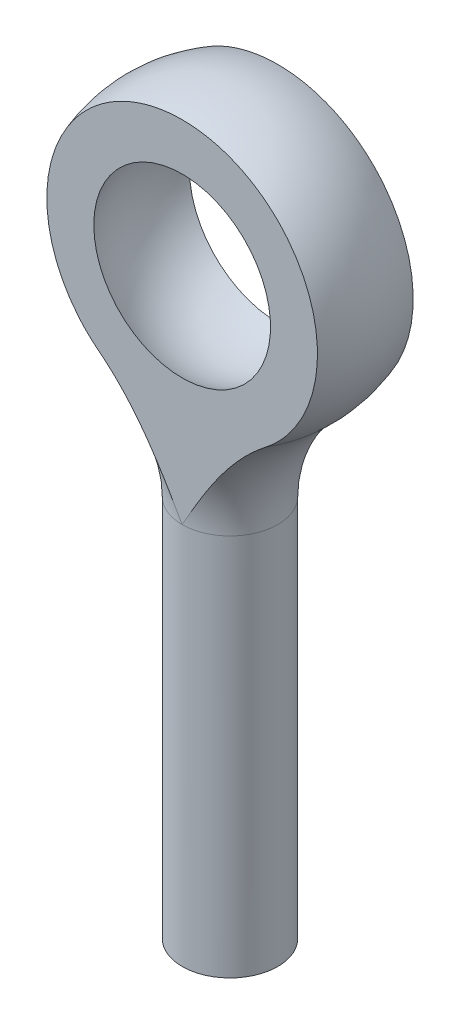
ISO-10303-21;
HEADER;
FILE_DESCRIPTION(('STEP AP214'),'2;1');
FILE_NAME('part.step','',(''),(''),'','','');
FILE_SCHEMA(('AUTOMOTIVE_DESIGN { 1 0 10303 214 1 1 1 1 }'));
ENDSEC;
DATA;
#1=APPLICATION_CONTEXT('core data for automotive mechanical design processes');
#2=APPLICATION_PROTOCOL_DEFINITION('international standard','automotive_design',2000,#1);
#3=PRODUCT_CONTEXT('',#1,'mechanical');
#4=PRODUCT('Part','Part','',(#3));
#5=PRODUCT_RELATED_PRODUCT_CATEGORY('part','',(#4));
#6=PRODUCT_DEFINITION_FORMATION('','',#4);
#7=PRODUCT_DEFINITION_CONTEXT('part definition',#1,'design');
#8=PRODUCT_DEFINITION('design','',#6,#7);
#9=PRODUCT_DEFINITION_SHAPE('','',#8);
#10=(LENGTH_UNIT() NAMED_UNIT(*) SI_UNIT(.MILLI.,.METRE.));
#11=(NAMED_UNIT(*) PLANE_ANGLE_UNIT() SI_UNIT($,.RADIAN.));
#12=(NAMED_UNIT(*) SI_UNIT($,.STERADIAN.) SOLID_ANGLE_UNIT());
#13=UNCERTAINTY_MEASURE_WITH_UNIT(LENGTH_MEASURE(1.E-05),#10,'distance_accuracy_value','');
#14=(GEOMETRIC_REPRESENTATION_CONTEXT(3) GLOBAL_UNCERTAINTY_ASSIGNED_CONTEXT((#13)) GLOBAL_UNIT_ASSIGNED_CONTEXT((#10,
#11,#12)) REPRESENTATION_CONTEXT('',''));
#15=CARTESIAN_POINT('',(0.,0.,0.));
#16=DIRECTION('',(0.,0.,1.));
#17=DIRECTION('',(1.,0.,0.));
#18=AXIS2_PLACEMENT_3D('',#15,#16,#17);
#19=CARTESIAN_POINT('',(0.,-14.2875,0.));
#20=DIRECTION('',(0.,1.,0.));
#21=DIRECTION('',(-1.,0.,0.));
#22=AXIS2_PLACEMENT_3D('',#19,#20,#21);
#23=TOROIDAL_SURFACE('',#22,12.8984375,9.72343750000001);
#24=CARTESIAN_POINT('',(0.,-14.2875,0.));
#25=DIRECTION('',(0.,1.,0.));
#26=DIRECTION('',(-1.,0.,0.));
#27=AXIS2_PLACEMENT_3D('',#24,#25,#26);
#28=CIRCLE('',#27,3.175);
#29=CARTESIAN_POINT('',(0.,-14.2875,-3.175));
#30=VERTEX_POINT('',#29);
#31=CARTESIAN_POINT('',(0.,-14.2875,3.175));
#32=VERTEX_POINT('',#31);
#33=EDGE_CURVE('E93',#30,#32,#28,.T.);
#34=ORIENTED_EDGE('',*,*,#33,.T.);
#35=CARTESIAN_POINT('',(0.,-14.2875,3.175));
#36=CARTESIAN_POINT('',(-0.00326153281159721,-14.2817923154181,3.175));
#37=CARTESIAN_POINT('',(-0.00652306727696982,-14.2760846301546,3.175));
#38=CARTESIAN_POINT('',(-0.273129494301175,-13.809525759704,3.175));
#39=CARTESIAN_POINT('',(-0.53656019263448,-13.3487136174838,3.175));
#40=CARTESIAN_POINT('',(-1.0756626544373,-12.4342721459859,3.175));
#41=CARTESIAN_POINT('',(-1.35133223124697,-11.9806415531072,3.175));
#42=CARTESIAN_POINT('',(-1.92559609440932,-11.0885509927537,3.175));
#43=CARTESIAN_POINT('',(-2.22416629497959,-10.6500757712216,3.175));
#44=CARTESIAN_POINT('',(-2.85309895635326,-9.79647723723617,3.175));
#45=CARTESIAN_POINT('',(-3.18344395170148,-9.38134129262933,3.175));
#46=CARTESIAN_POINT('',(-3.77466960917434,-8.70587244647446,3.175));
#47=CARTESIAN_POINT('',(-4.02585009163215,-8.43705950083892,3.175));
#48=CARTESIAN_POINT('',(-4.54711374418298,-7.91848534573002,3.175));
#49=CARTESIAN_POINT('',(-4.81719088363876,-7.66871811075041,3.175));
#50=CARTESIAN_POINT('',(-5.37662445742366,-7.19137231911344,3.175));
#51=CARTESIAN_POINT('',(-5.6659914755173,-6.96380611498348,3.175));
#52=CARTESIAN_POINT('',(-6.2632271576633,-6.53430962232207,3.175));
#53=CARTESIAN_POINT('',(-6.57109562045888,-6.3323790550032,3.175));
#54=CARTESIAN_POINT('',(-7.20718830542673,-5.95536220419303,3.175));
#55=CARTESIAN_POINT('',(-7.53558873729251,-5.780572088317,3.175));
#56=CARTESIAN_POINT('',(-8.20771747679854,-5.46330806936547,3.175));
#57=CARTESIAN_POINT('',(-8.55144656919851,-5.32083582310008,3.175));
#58=CARTESIAN_POINT('',(-9.25110720233212,-5.07093273595433,3.175));
#59=CARTESIAN_POINT('',(-9.60702765361083,-4.96347093780056,3.175));
#60=CARTESIAN_POINT('',(-10.3280020282538,-4.78558860509772,3.175));
#61=CARTESIAN_POINT('',(-10.693054404856,-4.71516184147821,3.175));
#62=CARTESIAN_POINT('',(-11.374148117839,-4.62053111903499,3.175));
#63=CARTESIAN_POINT('',(-11.6894621096171,-4.59103533000716,3.175));
#64=CARTESIAN_POINT('',(-12.3214131946278,-4.5608250527269,3.175));
#65=CARTESIAN_POINT('',(-12.6380499893196,-4.56010438774693,3.175));
#66=CARTESIAN_POINT('',(-13.2714560117925,-4.58791541176917,3.175));
#67=CARTESIAN_POINT('',(-13.588219993932,-4.61657245215532,3.175));
#68=CARTESIAN_POINT('',(-14.060301630958,-4.68169352507834,3.175));
#69=CARTESIAN_POINT('',(-14.2172131665411,-4.70710429698202,3.175));
#70=CARTESIAN_POINT('',(-14.529670991846,-4.76528994689923,3.175));
#71=CARTESIAN_POINT('',(-14.6852172275135,-4.79806511512578,3.175));
#72=CARTESIAN_POINT('',(-14.8399244089693,-4.83451129028153,3.175));
#73=B_SPLINE_CURVE_WITH_KNOTS('',3,(#35,#36,#37,#38,#39,#40,#41,#42,#43,#44,#45,#46,#47,#48,#49,
#50,#51,#52,#53,#54,#55,#56,#57,#58,#59,#60,#61,#62,#63,#64,#65,#66,#67,#68,#69,#70,#71,#72),
.UNSPECIFIED.,.F.,.F.,(4,2,2,2,2,2,2,2,2,2,2,2,2,2,2,2,2,2,4),(0.,0.0197214984217783,
1.61208077502438,3.20415668865261,4.79458050751384,6.38413506996752,7.48699761786803,
8.58950979207057,9.69263194050587,10.7957420914656,11.9101519427958,13.0246189126324,
14.1380977462368,15.2513892394383,16.2001992987223,17.148805689979,18.1014765942466,
18.5781908798237,19.0549239548517),.UNSPECIFIED.);
#74=CARTESIAN_POINT('',(-5.53702467552864,-7.07010309278351,3.175));
#75=VERTEX_POINT('',#74);
#76=EDGE_CURVE('E110',#32,#75,#73,.T.);
#77=ORIENTED_EDGE('',*,*,#76,.T.);
#78=CARTESIAN_POINT('',(0.,-7.07010309278351,0.));
#79=DIRECTION('',(0.,1.,0.));
#80=DIRECTION('',(-1.,0.,0.));
#81=AXIS2_PLACEMENT_3D('',#78,#79,#80);
#82=CIRCLE('',#81,6.38273195876288);
#83=CARTESIAN_POINT('',(-5.53702467552864,-7.07010309278351,-3.175));
#84=VERTEX_POINT('',#83);
#85=EDGE_CURVE('E96',#84,#75,#82,.T.);
#86=ORIENTED_EDGE('',*,*,#85,.F.);
#87=CARTESIAN_POINT('',(0.,-14.2875,-3.175));
#88=CARTESIAN_POINT('',(-0.00326153281159721,-14.2817923154181,-3.175));
#89=CARTESIAN_POINT('',(-0.00652306727696982,-14.2760846301546,-3.175));
#90=CARTESIAN_POINT('',(-0.273129494301175,-13.809525759704,-3.175));
#91=CARTESIAN_POINT('',(-0.53656019263448,-13.3487136174838,-3.175));
#92=CARTESIAN_POINT('',(-1.0756626544373,-12.4342721459859,-3.175));
#93=CARTESIAN_POINT('',(-1.35133223124697,-11.9806415531072,-3.175));
#94=CARTESIAN_POINT('',(-1.92559609440932,-11.0885509927537,-3.175));
#95=CARTESIAN_POINT('',(-2.22416629497959,-10.6500757712216,-3.175));
#96=CARTESIAN_POINT('',(-2.85309895635326,-9.79647723723617,-3.175));
#97=CARTESIAN_POINT('',(-3.18344395170148,-9.38134129262933,-3.175));
#98=CARTESIAN_POINT('',(-3.77466960917434,-8.70587244647446,-3.175));
#99=CARTESIAN_POINT('',(-4.02585009163215,-8.43705950083892,-3.175));
#100=CARTESIAN_POINT('',(-4.54711374418298,-7.91848534573002,-3.175));
#101=CARTESIAN_POINT('',(-4.81719088363876,-7.66871811075041,-3.175));
#102=CARTESIAN_POINT('',(-5.37662445742366,-7.19137231911344,-3.175));
#103=CARTESIAN_POINT('',(-5.6659914755173,-6.96380611498348,-3.175));
#104=CARTESIAN_POINT('',(-6.2632271576633,-6.53430962232207,-3.175));
#105=CARTESIAN_POINT('',(-6.57109562045888,-6.3323790550032,-3.175));
#106=CARTESIAN_POINT('',(-7.20718830542673,-5.95536220419303,-3.175));
#107=CARTESIAN_POINT('',(-7.53558873729251,-5.780572088317,-3.175));
#108=CARTESIAN_POINT('',(-8.20771747679854,-5.46330806936547,-3.175));
#109=CARTESIAN_POINT('',(-8.55144656919851,-5.32083582310008,-3.175));
#110=CARTESIAN_POINT('',(-9.25110720233212,-5.07093273595433,-3.175));
#111=CARTESIAN_POINT('',(-9.60702765361083,-4.96347093780056,-3.175));
#112=CARTESIAN_POINT('',(-10.3280020282538,-4.78558860509772,-3.175));
#113=CARTESIAN_POINT('',(-10.693054404856,-4.71516184147821,-3.175));
#114=CARTESIAN_POINT('',(-11.374148117839,-4.62053111903499,-3.175));
#115=CARTESIAN_POINT('',(-11.6894621096171,-4.59103533000716,-3.175));
#116=CARTESIAN_POINT('',(-12.3214131946278,-4.5608250527269,-3.175));
#117=CARTESIAN_POINT('',(-12.6380499893196,-4.56010438774693,-3.175));
#118=CARTESIAN_POINT('',(-13.2714560117925,-4.58791541176917,-3.175));
#119=CARTESIAN_POINT('',(-13.588219993932,-4.61657245215532,-3.175));
#120=CARTESIAN_POINT('',(-14.060301630958,-4.68169352507834,-3.175));
#121=CARTESIAN_POINT('',(-14.2172131665411,-4.70710429698202,-3.175));
#122=CARTESIAN_POINT('',(-14.529670991846,-4.76528994689923,-3.175));
#123=CARTESIAN_POINT('',(-14.6852172275135,-4.79806511512578,-3.175));
#124=CARTESIAN_POINT('',(-14.8399244089693,-4.83451129028153,-3.175));
#125=B_SPLINE_CURVE_WITH_KNOTS('',3,(#87,#88,#89,#90,#91,#92,#93,#94,#95,#96,#97,#98,#99,#100,
#101,#102,#103,#104,#105,#106,#107,#108,#109,#110,#111,#112,#113,#114,#115,#116,#117,#118,#119,
#120,#121,#122,#123,#124),.UNSPECIFIED.,.F.,.F.,(4,2,2,2,2,2,2,2,2,2,2,2,2,2,2,2,2,2,4),(0.,
0.0197214984217783,1.61208077502438,3.20415668865261,4.79458050751384,6.38413506996752,
7.48699761786803,8.58950979207057,9.69263194050587,10.7957420914656,11.9101519427958,
13.0246189126324,14.1380977462368,15.2513892394383,16.2001992987223,17.148805689979,
18.1014765942466,18.5781908798237,19.0549239548517),.UNSPECIFIED.);
#126=EDGE_CURVE('E63',#30,#84,#125,.T.);
#127=ORIENTED_EDGE('',*,*,#126,.F.);
#128=EDGE_LOOP('',(#34,#77,#86,#127));
#129=FACE_BOUND('',#128,.T.);
#130=ADVANCED_FACE('F47',(#129),#23,.F.);
#131=CARTESIAN_POINT('',(5.53702467552865,-7.07010309278351,3.175));
#132=VERTEX_POINT('',#131);
#133=CARTESIAN_POINT('',(5.53702467552865,-7.07010309278351,-3.175));
#134=VERTEX_POINT('',#133);
#135=EDGE_CURVE('E101',#132,#134,#82,.T.);
#136=ORIENTED_EDGE('',*,*,#135,.F.);
#137=CARTESIAN_POINT('',(0.,-14.2875,3.175));
#138=CARTESIAN_POINT('',(0.00326153281160762,-14.2817923154181,3.175));
#139=CARTESIAN_POINT('',(0.00652306727698023,-14.2760846301546,3.175));
#140=CARTESIAN_POINT('',(0.273129494301185,-13.809525759704,3.175));
#141=CARTESIAN_POINT('',(0.536560192634491,-13.3487136174838,3.175));
#142=CARTESIAN_POINT('',(1.07566265443731,-12.4342721459859,3.175));
#143=CARTESIAN_POINT('',(1.35133223124698,-11.9806415531072,3.175));
#144=CARTESIAN_POINT('',(1.92559609440933,-11.0885509927537,3.175));
#145=CARTESIAN_POINT('',(2.2241662949796,-10.6500757712216,3.175));
#146=CARTESIAN_POINT('',(2.85309895635327,-9.79647723723617,3.175));
#147=CARTESIAN_POINT('',(3.18344395170149,-9.38134129262933,3.175));
#148=CARTESIAN_POINT('',(3.77466960917435,-8.70587244647446,3.175));
#149=CARTESIAN_POINT('',(4.02585009163216,-8.43705950083892,3.175));
#150=CARTESIAN_POINT('',(4.54711374418298,-7.91848534573002,3.175));
#151=CARTESIAN_POINT('',(4.81719088363877,-7.66871811075041,3.175));
#152=CARTESIAN_POINT('',(5.37662445742366,-7.19137231911343,3.175));
#153=CARTESIAN_POINT('',(5.6659914755173,-6.96380611498347,3.175));
#154=CARTESIAN_POINT('',(6.2632271576633,-6.53430962232206,3.175));
#155=CARTESIAN_POINT('',(6.57109562045889,-6.33237905500319,3.175));
#156=CARTESIAN_POINT('',(7.20718830542673,-5.95536220419302,3.175));
#157=CARTESIAN_POINT('',(7.53558873729251,-5.780572088317,3.175));
#158=CARTESIAN_POINT('',(8.20771747679855,-5.46330806936547,3.175));
#159=CARTESIAN_POINT('',(8.55144656919852,-5.32083582310008,3.175));
#160=CARTESIAN_POINT('',(9.25110720233212,-5.07093273595433,3.175));
#161=CARTESIAN_POINT('',(9.60702765361083,-4.96347093780056,3.175));
#162=CARTESIAN_POINT('',(10.3280020282538,-4.78558860509772,3.175));
#163=CARTESIAN_POINT('',(10.693054404856,-4.71516184147821,3.175));
#164=CARTESIAN_POINT('',(11.3741481178391,-4.62053111903499,3.175));
#165=CARTESIAN_POINT('',(11.6894621096171,-4.59103533000715,3.175));
#166=CARTESIAN_POINT('',(12.3214131946278,-4.5608250527269,3.175));
#167=CARTESIAN_POINT('',(12.6380499893196,-4.56010438774693,3.175));
#168=CARTESIAN_POINT('',(13.2714560117925,-4.58791541176916,3.175));
#169=CARTESIAN_POINT('',(13.588219993932,-4.61657245215531,3.175));
#170=CARTESIAN_POINT('',(14.060301630958,-4.68169352507833,3.175));
#171=CARTESIAN_POINT('',(14.2172131665411,-4.70710429698201,3.175));
#172=CARTESIAN_POINT('',(14.529670991846,-4.76528994689923,3.175));
#173=CARTESIAN_POINT('',(14.6852172275135,-4.79806511512577,3.175));
#174=CARTESIAN_POINT('',(14.8399244089693,-4.83451129028152,3.175));
#175=B_SPLINE_CURVE_WITH_KNOTS('',3,(#137,#138,#139,#140,#141,#142,#143,#144,#145,#146,#147,
#148,#149,#150,#151,#152,#153,#154,#155,#156,#157,#158,#159,#160,#161,#162,#163,#164,#165,#166,
#167,#168,#169,#170,#171,#172,#173,#174),.UNSPECIFIED.,.F.,.F.,(4,2,2,2,2,2,2,2,2,2,2,2,2,2,2,2,
2,2,4),(0.,0.0197214984217783,1.61208077502438,3.20415668865261,4.79458050751385,
6.38413506996752,7.48699761786803,8.58950979207057,9.69263194050587,10.7957420914656,
11.9101519427958,13.0246189126324,14.1380977462368,15.2513892394383,16.2001992987223,
17.148805689979,18.1014765942466,18.5781908798237,19.0549239548517),.UNSPECIFIED.);
#176=EDGE_CURVE('E71',#132,#32,#175,.F.);
#177=ORIENTED_EDGE('',*,*,#176,.T.);
#178=EDGE_CURVE('E100',#32,#30,#28,.T.);
#179=ORIENTED_EDGE('',*,*,#178,.T.);
#180=CARTESIAN_POINT('',(0.,-14.2875,-3.175));
#181=CARTESIAN_POINT('',(0.00326153281160762,-14.2817923154181,-3.175));
#182=CARTESIAN_POINT('',(0.00652306727698023,-14.2760846301546,-3.175));
#183=CARTESIAN_POINT('',(0.273129494301185,-13.809525759704,-3.175));
#184=CARTESIAN_POINT('',(0.536560192634491,-13.3487136174838,-3.175));
#185=CARTESIAN_POINT('',(1.07566265443731,-12.4342721459859,-3.175));
#186=CARTESIAN_POINT('',(1.35133223124698,-11.9806415531072,-3.175));
#187=CARTESIAN_POINT('',(1.92559609440933,-11.0885509927537,-3.175));
#188=CARTESIAN_POINT('',(2.2241662949796,-10.6500757712216,-3.175));
#189=CARTESIAN_POINT('',(2.85309895635327,-9.79647723723617,-3.175));
#190=CARTESIAN_POINT('',(3.18344395170149,-9.38134129262933,-3.175));
#191=CARTESIAN_POINT('',(3.77466960917435,-8.70587244647446,-3.175));
#192=CARTESIAN_POINT('',(4.02585009163216,-8.43705950083892,-3.175));
#193=CARTESIAN_POINT('',(4.54711374418298,-7.91848534573002,-3.175));
#194=CARTESIAN_POINT('',(4.81719088363877,-7.66871811075041,-3.175));
#195=CARTESIAN_POINT('',(5.37662445742366,-7.19137231911343,-3.175));
#196=CARTESIAN_POINT('',(5.6659914755173,-6.96380611498347,-3.175));
#197=CARTESIAN_POINT('',(6.2632271576633,-6.53430962232206,-3.175));
#198=CARTESIAN_POINT('',(6.57109562045889,-6.33237905500319,-3.175));
#199=CARTESIAN_POINT('',(7.20718830542673,-5.95536220419302,-3.175));
#200=CARTESIAN_POINT('',(7.53558873729251,-5.780572088317,-3.175));
#201=CARTESIAN_POINT('',(8.20771747679855,-5.46330806936547,-3.175));
#202=CARTESIAN_POINT('',(8.55144656919852,-5.32083582310008,-3.175));
#203=CARTESIAN_POINT('',(9.25110720233212,-5.07093273595433,-3.175));
#204=CARTESIAN_POINT('',(9.60702765361083,-4.96347093780056,-3.175));
#205=CARTESIAN_POINT('',(10.3280020282538,-4.78558860509772,-3.175));
#206=CARTESIAN_POINT('',(10.693054404856,-4.71516184147821,-3.175));
#207=CARTESIAN_POINT('',(11.3741481178391,-4.62053111903499,-3.175));
#208=CARTESIAN_POINT('',(11.6894621096171,-4.59103533000715,-3.175));
#209=CARTESIAN_POINT('',(12.3214131946278,-4.5608250527269,-3.175));
#210=CARTESIAN_POINT('',(12.6380499893196,-4.56010438774693,-3.175));
#211=CARTESIAN_POINT('',(13.2714560117925,-4.58791541176916,-3.175));
#212=CARTESIAN_POINT('',(13.588219993932,-4.61657245215531,-3.175));
#213=CARTESIAN_POINT('',(14.060301630958,-4.68169352507833,-3.175));
#214=CARTESIAN_POINT('',(14.2172131665411,-4.70710429698201,-3.175));
#215=CARTESIAN_POINT('',(14.529670991846,-4.76528994689923,-3.175));
#216=CARTESIAN_POINT('',(14.6852172275135,-4.79806511512577,-3.175));
#217=CARTESIAN_POINT('',(14.8399244089693,-4.83451129028152,-3.175));
#218=B_SPLINE_CURVE_WITH_KNOTS('',3,(#180,#181,#182,#183,#184,#185,#186,#187,#188,#189,#190,
#191,#192,#193,#194,#195,#196,#197,#198,#199,#200,#201,#202,#203,#204,#205,#206,#207,#208,#209,
#210,#211,#212,#213,#214,#215,#216,#217),.UNSPECIFIED.,.F.,.F.,(4,2,2,2,2,2,2,2,2,2,2,2,2,2,2,2,
2,2,4),(0.,0.0197214984217783,1.61208077502438,3.20415668865261,4.79458050751385,
6.38413506996752,7.48699761786803,8.58950979207057,9.69263194050587,10.7957420914656,
11.9101519427958,13.0246189126324,14.1380977462368,15.2513892394383,16.2001992987223,
17.148805689979,18.1014765942466,18.5781908798237,19.0549239548517),.UNSPECIFIED.);
#219=EDGE_CURVE('E80',#134,#30,#218,.F.);
#220=ORIENTED_EDGE('',*,*,#219,.F.);
#221=EDGE_LOOP('',(#136,#177,#179,#220));
#222=FACE_BOUND('',#221,.T.);
#223=ADVANCED_FACE('F103',(#222),#23,.F.);
#224=CARTESIAN_POINT('',(0.,0.,0.));
#225=DIRECTION('',(0.,1.,0.));
#226=DIRECTION('',(1.,0.,0.));
#227=AXIS2_PLACEMENT_3D('',#224,#225,#226);
#228=SPHERICAL_SURFACE('',#227,9.525);
#229=ORIENTED_EDGE('',*,*,#85,.T.);
#230=CARTESIAN_POINT('',(0.,0.,3.175));
#231=DIRECTION('',(0.,0.,-1.));
#232=DIRECTION('',(-1.,0.,0.));
#233=AXIS2_PLACEMENT_3D('',#230,#231,#232);
#234=CIRCLE('',#233,8.98025612106915);
#235=EDGE_CURVE('E11',#75,#132,#234,.T.);
#236=ORIENTED_EDGE('',*,*,#235,.T.);
#237=ORIENTED_EDGE('',*,*,#135,.T.);
#238=CARTESIAN_POINT('',(0.,0.,-3.175));
#239=DIRECTION('',(0.,0.,-1.));
#240=DIRECTION('',(-1.,0.,0.));
#241=AXIS2_PLACEMENT_3D('',#238,#239,#240);
#242=CIRCLE('',#241,8.98025612106915);
#243=EDGE_CURVE('E56',#84,#134,#242,.T.);
#244=ORIENTED_EDGE('',*,*,#243,.F.);
#245=EDGE_LOOP('',(#229,#236,#237,#244));
#246=FACE_BOUND('',#245,.T.);
#247=ADVANCED_FACE('F160',(#246),#228,.T.);
#248=CARTESIAN_POINT('',(0.,9.525,0.));
#249=DIRECTION('',(0.,1.,0.));
#250=DIRECTION('',(-1.,0.,0.));
#251=AXIS2_PLACEMENT_3D('',#248,#249,#250);
#252=CYLINDRICAL_SURFACE('',#251,3.175);
#253=ORIENTED_EDGE('',*,*,#178,.F.);
#254=ORIENTED_EDGE('',*,*,#33,.F.);
#255=EDGE_LOOP('',(#253,#254));
#256=FACE_BOUND('',#255,.T.);
#257=CARTESIAN_POINT('',(0.,-39.6875,0.));
#258=DIRECTION('',(0.,1.,0.));
#259=DIRECTION('',(-1.,0.,0.));
#260=AXIS2_PLACEMENT_3D('',#257,#258,#259);
#261=CIRCLE('',#260,3.17499999999999);
#262=CARTESIAN_POINT('',(-3.17499999999998,-39.6875,0.));
#263=VERTEX_POINT('',#262);
#264=EDGE_CURVE('E107',#263,#263,#261,.T.);
#265=ORIENTED_EDGE('',*,*,#264,.T.);
#266=EDGE_LOOP('',(#265));
#267=FACE_BOUND('',#266,.T.);
#268=ADVANCED_FACE('F49',(#256,#267),#252,.T.);
#269=CARTESIAN_POINT('',(0.,-39.6875,0.));
#270=DIRECTION('',(0.,1.,0.));
#271=DIRECTION('',(-1.,0.,0.));
#272=AXIS2_PLACEMENT_3D('',#269,#270,#271);
#273=PLANE('',#272);
#274=ORIENTED_EDGE('',*,*,#264,.F.);
#275=EDGE_LOOP('',(#274));
#276=FACE_BOUND('',#275,.T.);
#277=ADVANCED_FACE('F134',(#276),#273,.F.);
#278=CARTESIAN_POINT('',(-9.525,0.,-3.175));
#279=DIRECTION('',(0.,0.,-1.));
#280=DIRECTION('',(-1.,0.,0.));
#281=AXIS2_PLACEMENT_3D('',#278,#279,#280);
#282=PLANE('',#281);
#283=CARTESIAN_POINT('',(0.,0.,-3.175));
#284=DIRECTION('',(0.,0.,-1.));
#285=DIRECTION('',(-1.,0.,0.));
#286=AXIS2_PLACEMENT_3D('',#283,#284,#285);
#287=CIRCLE('',#286,5.86301383675666);
#288=CARTESIAN_POINT('',(-5.86301383675666,0.,-3.175));
#289=VERTEX_POINT('',#288);
#290=EDGE_CURVE('E86',#289,#289,#287,.T.);
#291=ORIENTED_EDGE('',*,*,#290,.F.);
#292=EDGE_LOOP('',(#291));
#293=FACE_BOUND('',#292,.T.);
#294=ORIENTED_EDGE('',*,*,#126,.T.);
#295=ORIENTED_EDGE('',*,*,#243,.T.);
#296=ORIENTED_EDGE('',*,*,#219,.T.);
#297=EDGE_LOOP('',(#294,#295,#296));
#298=FACE_BOUND('',#297,.T.);
#299=ADVANCED_FACE('F81',(#293,#298),#282,.T.);
#300=CARTESIAN_POINT('',(-9.525,0.,3.175));
#301=DIRECTION('',(0.,0.,-1.));
#302=DIRECTION('',(-1.,0.,0.));
#303=AXIS2_PLACEMENT_3D('',#300,#301,#302);
#304=PLANE('',#303);
#305=CARTESIAN_POINT('',(0.,0.,3.175));
#306=DIRECTION('',(0.,0.,-1.));
#307=DIRECTION('',(-1.,0.,0.));
#308=AXIS2_PLACEMENT_3D('',#305,#306,#307);
#309=CIRCLE('',#308,5.86301383675666);
#310=CARTESIAN_POINT('',(-5.86301383675666,0.,3.175));
#311=VERTEX_POINT('',#310);
#312=EDGE_CURVE('E51',#311,#311,#309,.T.);
#313=ORIENTED_EDGE('',*,*,#312,.T.);
#314=EDGE_LOOP('',(#313));
#315=FACE_BOUND('',#314,.T.);
#316=ORIENTED_EDGE('',*,*,#176,.F.);
#317=ORIENTED_EDGE('',*,*,#235,.F.);
#318=ORIENTED_EDGE('',*,*,#76,.F.);
#319=EDGE_LOOP('',(#316,#317,#318));
#320=FACE_BOUND('',#319,.T.);
#321=ADVANCED_FACE('F123',(#315,#320),#304,.F.);
#322=CARTESIAN_POINT('',(0.,0.,0.));
#323=DIRECTION('',(0.,1.,0.));
#324=DIRECTION('',(1.,0.,0.));
#325=AXIS2_PLACEMENT_3D('',#322,#323,#324);
#326=SPHERICAL_SURFACE('',#325,6.6675);
#327=CARTESIAN_POINT('',(0.,0.,0.));
#328=DIRECTION('',(0.,0.,-1.));
#329=DIRECTION('',(-1.,0.,0.));
#330=AXIS2_PLACEMENT_3D('',#327,#328,#329);
#331=SPHERICAL_SURFACE('',#330,6.6675);
#332=ORIENTED_EDGE('',*,*,#290,.T.);
#333=EDGE_LOOP('',(#332));
#334=FACE_BOUND('',#333,.T.);
#335=ORIENTED_EDGE('',*,*,#312,.F.);
#336=EDGE_LOOP('',(#335));
#337=FACE_BOUND('',#336,.T.);
#338=ADVANCED_FACE('F128',(#334,#337),#331,.F.);
#339=CLOSED_SHELL('',(#130,#223,#247,#268,#277,#299,#321,#338));
#340=MANIFOLD_SOLID_BREP('B2',#339);
#341=ADVANCED_BREP_SHAPE_REPRESENTATION('',(#18,#340),#14);
#342=SHAPE_DEFINITION_REPRESENTATION(#9,#341);
ENDSEC;
END-ISO-10303-21;
